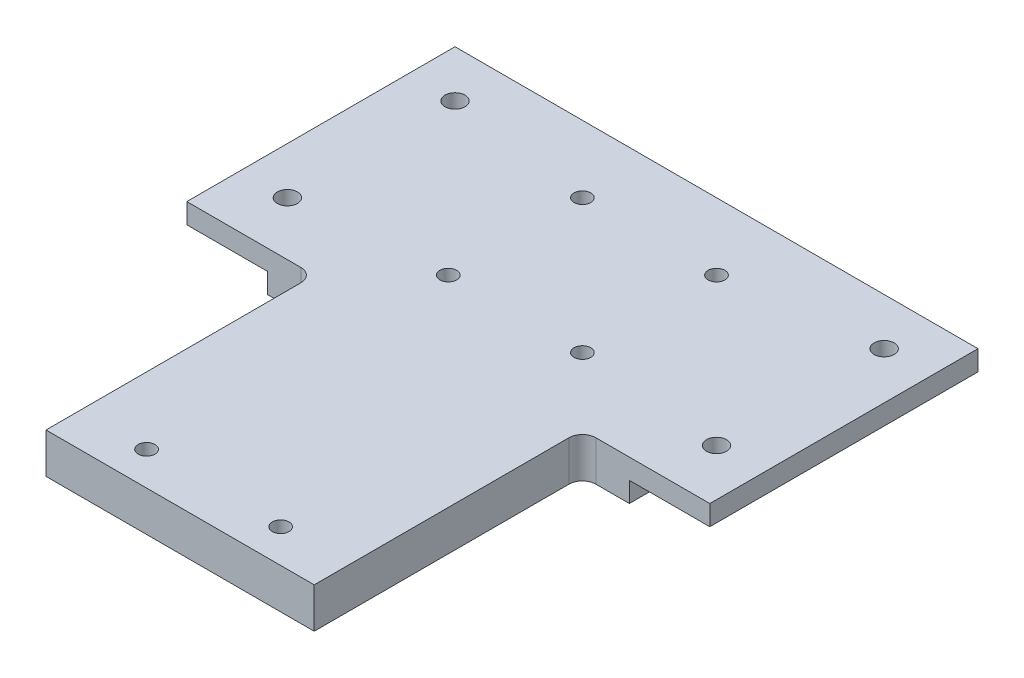
ISO-10303-21;
HEADER;
FILE_DESCRIPTION(('STEP AP214'),'2;1');
FILE_NAME('part.step','',(''),(''),'','','');
FILE_SCHEMA(('AUTOMOTIVE_DESIGN { 1 0 10303 214 1 1 1 1 }'));
ENDSEC;
DATA;
#1=APPLICATION_CONTEXT('core data for automotive mechanical design processes');
#2=APPLICATION_PROTOCOL_DEFINITION('international standard','automotive_design',2000,#1);
#3=PRODUCT_CONTEXT('',#1,'mechanical');
#4=PRODUCT('Part','Part','',(#3));
#5=PRODUCT_RELATED_PRODUCT_CATEGORY('part','',(#4));
#6=PRODUCT_DEFINITION_FORMATION('','',#4);
#7=PRODUCT_DEFINITION_CONTEXT('part definition',#1,'design');
#8=PRODUCT_DEFINITION('design','',#6,#7);
#9=PRODUCT_DEFINITION_SHAPE('','',#8);
#10=(LENGTH_UNIT() NAMED_UNIT(*) SI_UNIT(.MILLI.,.METRE.));
#11=(NAMED_UNIT(*) PLANE_ANGLE_UNIT() SI_UNIT($,.RADIAN.));
#12=(NAMED_UNIT(*) SI_UNIT($,.STERADIAN.) SOLID_ANGLE_UNIT());
#13=UNCERTAINTY_MEASURE_WITH_UNIT(LENGTH_MEASURE(1.E-05),#10,'distance_accuracy_value','');
#14=(GEOMETRIC_REPRESENTATION_CONTEXT(3) GLOBAL_UNCERTAINTY_ASSIGNED_CONTEXT((#13)) GLOBAL_UNIT_ASSIGNED_CONTEXT((#10,
#11,#12)) REPRESENTATION_CONTEXT('',''));
#15=CARTESIAN_POINT('',(0.,0.,0.));
#16=DIRECTION('',(0.,0.,1.));
#17=DIRECTION('',(1.,0.,0.));
#18=AXIS2_PLACEMENT_3D('',#15,#16,#17);
#19=CARTESIAN_POINT('',(59.,6.,-80.));
#20=DIRECTION('',(-1.,0.,0.));
#21=DIRECTION('',(0.,0.,1.));
#22=AXIS2_PLACEMENT_3D('',#19,#20,#21);
#23=PLANE('',#22);
#24=DIRECTION('',(0.,0.,1.));
#25=VECTOR('',#24,1.);
#26=CARTESIAN_POINT('',(59.,3.,-80.));
#27=LINE('',#26,#25);
#28=CARTESIAN_POINT('',(59.,3.,-80.));
#29=VERTEX_POINT('',#28);
#30=CARTESIAN_POINT('',(59.,3.,-40.));
#31=VERTEX_POINT('',#30);
#32=EDGE_CURVE('E260',#29,#31,#27,.T.);
#33=ORIENTED_EDGE('',*,*,#32,.F.);
#34=DIRECTION('',(0.,-1.,0.));
#35=VECTOR('',#34,1.);
#36=CARTESIAN_POINT('',(59.,6.,-80.));
#37=LINE('',#36,#35);
#38=CARTESIAN_POINT('',(59.,6.,-80.));
#39=VERTEX_POINT('',#38);
#40=EDGE_CURVE('E165',#39,#29,#37,.T.);
#41=ORIENTED_EDGE('',*,*,#40,.F.);
#42=DIRECTION('',(0.,0.,-1.));
#43=VECTOR('',#42,1.);
#44=CARTESIAN_POINT('',(59.,6.,-80.));
#45=LINE('',#44,#43);
#46=CARTESIAN_POINT('',(59.,6.,-40.));
#47=VERTEX_POINT('',#46);
#48=EDGE_CURVE('E229',#47,#39,#45,.T.);
#49=ORIENTED_EDGE('',*,*,#48,.F.);
#50=DIRECTION('',(0.,-1.,0.));
#51=VECTOR('',#50,1.);
#52=CARTESIAN_POINT('',(59.,6.,-40.));
#53=LINE('',#52,#51);
#54=EDGE_CURVE('E169',#47,#31,#53,.T.);
#55=ORIENTED_EDGE('',*,*,#54,.T.);
#56=EDGE_LOOP('',(#33,#41,#49,#55));
#57=FACE_BOUND('',#56,.T.);
#58=ADVANCED_FACE('F41',(#57),#23,.F.);
#59=CARTESIAN_POINT('',(0.,6.,-40.));
#60=DIRECTION('',(1.,0.,0.));
#61=DIRECTION('',(0.,0.,-1.));
#62=AXIS2_PLACEMENT_3D('',#59,#60,#61);
#63=PLANE('',#62);
#64=DIRECTION('',(0.,0.,1.));
#65=VECTOR('',#64,1.);
#66=CARTESIAN_POINT('',(0.,6.,-40.));
#67=LINE('',#66,#65);
#68=CARTESIAN_POINT('',(0.,6.,-38.));
#69=VERTEX_POINT('',#68);
#70=CARTESIAN_POINT('',(0.,6.,0.));
#71=VERTEX_POINT('',#70);
#72=EDGE_CURVE('E247',#69,#71,#67,.T.);
#73=ORIENTED_EDGE('',*,*,#72,.F.);
#74=DIRECTION('',(0.,-1.,0.));
#75=VECTOR('',#74,1.);
#76=CARTESIAN_POINT('',(0.,0.,-38.));
#77=LINE('',#76,#75);
#78=CARTESIAN_POINT('',(0.,0.,-38.));
#79=VERTEX_POINT('',#78);
#80=EDGE_CURVE('E183',#69,#79,#77,.T.);
#81=ORIENTED_EDGE('',*,*,#80,.T.);
#82=DIRECTION('',(0.,0.,1.));
#83=VECTOR('',#82,1.);
#84=CARTESIAN_POINT('',(0.,0.,-40.));
#85=LINE('',#84,#83);
#86=CARTESIAN_POINT('',(0.,0.,0.));
#87=VERTEX_POINT('',#86);
#88=EDGE_CURVE('E240',#79,#87,#85,.T.);
#89=ORIENTED_EDGE('',*,*,#88,.T.);
#90=DIRECTION('',(0.,-1.,0.));
#91=VECTOR('',#90,1.);
#92=CARTESIAN_POINT('',(0.,6.,0.));
#93=LINE('',#92,#91);
#94=EDGE_CURVE('E180',#71,#87,#93,.T.);
#95=ORIENTED_EDGE('',*,*,#94,.F.);
#96=EDGE_LOOP('',(#73,#81,#89,#95));
#97=FACE_BOUND('',#96,.T.);
#98=ADVANCED_FACE('F363',(#97),#63,.F.);
#99=CARTESIAN_POINT('',(0.,6.,0.));
#100=DIRECTION('',(0.,0.,-1.));
#101=DIRECTION('',(-1.,0.,0.));
#102=AXIS2_PLACEMENT_3D('',#99,#100,#101);
#103=PLANE('',#102);
#104=DIRECTION('',(1.,0.,0.));
#105=VECTOR('',#104,1.);
#106=CARTESIAN_POINT('',(0.,0.,0.));
#107=LINE('',#106,#105);
#108=CARTESIAN_POINT('',(40.,0.,0.));
#109=VERTEX_POINT('',#108);
#110=EDGE_CURVE('E215',#87,#109,#107,.T.);
#111=ORIENTED_EDGE('',*,*,#110,.T.);
#112=DIRECTION('',(0.,-1.,0.));
#113=VECTOR('',#112,1.);
#114=CARTESIAN_POINT('',(40.,6.,0.));
#115=LINE('',#114,#113);
#116=CARTESIAN_POINT('',(40.,6.,0.));
#117=VERTEX_POINT('',#116);
#118=EDGE_CURVE('E177',#117,#109,#115,.T.);
#119=ORIENTED_EDGE('',*,*,#118,.F.);
#120=DIRECTION('',(1.,0.,0.));
#121=VECTOR('',#120,1.);
#122=CARTESIAN_POINT('',(0.,6.,0.));
#123=LINE('',#122,#121);
#124=EDGE_CURVE('E233',#71,#117,#123,.T.);
#125=ORIENTED_EDGE('',*,*,#124,.F.);
#126=ORIENTED_EDGE('',*,*,#94,.T.);
#127=EDGE_LOOP('',(#111,#119,#125,#126));
#128=FACE_BOUND('',#127,.T.);
#129=ADVANCED_FACE('F371',(#128),#103,.F.);
#130=CARTESIAN_POINT('',(40.,6.,-40.));
#131=DIRECTION('',(-1.,0.,0.));
#132=DIRECTION('',(0.,0.,1.));
#133=AXIS2_PLACEMENT_3D('',#130,#131,#132);
#134=PLANE('',#133);
#135=DIRECTION('',(0.,0.,-1.));
#136=VECTOR('',#135,1.);
#137=CARTESIAN_POINT('',(40.,0.,-40.));
#138=LINE('',#137,#136);
#139=CARTESIAN_POINT('',(40.,0.,-38.));
#140=VERTEX_POINT('',#139);
#141=EDGE_CURVE('E204',#109,#140,#138,.T.);
#142=ORIENTED_EDGE('',*,*,#141,.T.);
#143=DIRECTION('',(0.,-1.,0.));
#144=VECTOR('',#143,1.);
#145=CARTESIAN_POINT('',(40.,6.,-38.));
#146=LINE('',#145,#144);
#147=CARTESIAN_POINT('',(40.,6.,-38.));
#148=VERTEX_POINT('',#147);
#149=EDGE_CURVE('E191',#140,#148,#146,.F.);
#150=ORIENTED_EDGE('',*,*,#149,.T.);
#151=DIRECTION('',(0.,0.,-1.));
#152=VECTOR('',#151,1.);
#153=CARTESIAN_POINT('',(40.,6.,-40.));
#154=LINE('',#153,#152);
#155=EDGE_CURVE('E224',#117,#148,#154,.T.);
#156=ORIENTED_EDGE('',*,*,#155,.F.);
#157=ORIENTED_EDGE('',*,*,#118,.T.);
#158=EDGE_LOOP('',(#142,#150,#156,#157));
#159=FACE_BOUND('',#158,.T.);
#160=ADVANCED_FACE('F211',(#159),#134,.F.);
#161=CARTESIAN_POINT('',(59.,6.,-40.));
#162=DIRECTION('',(0.,0.,-1.));
#163=DIRECTION('',(-1.,0.,0.));
#164=AXIS2_PLACEMENT_3D('',#161,#162,#163);
#165=PLANE('',#164);
#166=DIRECTION('',(1.,0.,0.));
#167=VECTOR('',#166,1.);
#168=CARTESIAN_POINT('',(59.,0.,-40.));
#169=LINE('',#168,#167);
#170=CARTESIAN_POINT('',(42.,0.,-40.));
#171=VERTEX_POINT('',#170);
#172=CARTESIAN_POINT('',(47.,0.,-40.));
#173=VERTEX_POINT('',#172);
#174=EDGE_CURVE('E206',#171,#173,#169,.T.);
#175=ORIENTED_EDGE('',*,*,#174,.T.);
#176=DIRECTION('',(0.,-1.,0.));
#177=VECTOR('',#176,1.);
#178=CARTESIAN_POINT('',(47.,3.,-40.));
#179=LINE('',#178,#177);
#180=CARTESIAN_POINT('',(47.,3.,-40.));
#181=VERTEX_POINT('',#180);
#182=EDGE_CURVE('E56',#181,#173,#179,.T.);
#183=ORIENTED_EDGE('',*,*,#182,.F.);
#184=DIRECTION('',(-1.,0.,0.));
#185=VECTOR('',#184,1.);
#186=CARTESIAN_POINT('',(59.,3.,-40.));
#187=LINE('',#186,#185);
#188=EDGE_CURVE('E262',#31,#181,#187,.T.);
#189=ORIENTED_EDGE('',*,*,#188,.F.);
#190=ORIENTED_EDGE('',*,*,#54,.F.);
#191=DIRECTION('',(1.,0.,0.));
#192=VECTOR('',#191,1.);
#193=CARTESIAN_POINT('',(59.,6.,-40.));
#194=LINE('',#193,#192);
#195=CARTESIAN_POINT('',(42.,6.,-40.));
#196=VERTEX_POINT('',#195);
#197=EDGE_CURVE('E222',#196,#47,#194,.T.);
#198=ORIENTED_EDGE('',*,*,#197,.F.);
#199=DIRECTION('',(0.,-1.,0.));
#200=VECTOR('',#199,1.);
#201=CARTESIAN_POINT('',(42.,0.,-40.));
#202=LINE('',#201,#200);
#203=EDGE_CURVE('E188',#196,#171,#202,.T.);
#204=ORIENTED_EDGE('',*,*,#203,.T.);
#205=EDGE_LOOP('',(#175,#183,#189,#190,#198,#204));
#206=FACE_BOUND('',#205,.T.);
#207=ADVANCED_FACE('F226',(#206),#165,.F.);
#208=CARTESIAN_POINT('',(-19.,6.,-80.));
#209=DIRECTION('',(0.,0.,1.));
#210=DIRECTION('',(1.,0.,0.));
#211=AXIS2_PLACEMENT_3D('',#208,#209,#210);
#212=PLANE('',#211);
#213=DIRECTION('',(-1.,0.,0.));
#214=VECTOR('',#213,1.);
#215=CARTESIAN_POINT('',(-19.,0.,-80.));
#216=LINE('',#215,#214);
#217=CARTESIAN_POINT('',(47.,0.,-80.));
#218=VERTEX_POINT('',#217);
#219=CARTESIAN_POINT('',(-6.99999999999998,0.,-80.));
#220=VERTEX_POINT('',#219);
#221=EDGE_CURVE('E245',#218,#220,#216,.T.);
#222=ORIENTED_EDGE('',*,*,#221,.T.);
#223=DIRECTION('',(0.,-1.,0.));
#224=VECTOR('',#223,1.);
#225=CARTESIAN_POINT('',(-6.99999999999998,3.,-80.));
#226=LINE('',#225,#224);
#227=CARTESIAN_POINT('',(-6.99999999999998,3.,-80.));
#228=VERTEX_POINT('',#227);
#229=EDGE_CURVE('E64',#228,#220,#226,.T.);
#230=ORIENTED_EDGE('',*,*,#229,.F.);
#231=DIRECTION('',(1.,0.,0.));
#232=VECTOR('',#231,1.);
#233=CARTESIAN_POINT('',(-6.99999999999998,3.,-80.));
#234=LINE('',#233,#232);
#235=CARTESIAN_POINT('',(-19.,3.,-80.));
#236=VERTEX_POINT('',#235);
#237=EDGE_CURVE('E145',#236,#228,#234,.T.);
#238=ORIENTED_EDGE('',*,*,#237,.F.);
#239=DIRECTION('',(0.,-1.,0.));
#240=VECTOR('',#239,1.);
#241=CARTESIAN_POINT('',(-19.,6.,-80.));
#242=LINE('',#241,#240);
#243=CARTESIAN_POINT('',(-19.,6.,-80.));
#244=VERTEX_POINT('',#243);
#245=EDGE_CURVE('E159',#244,#236,#242,.T.);
#246=ORIENTED_EDGE('',*,*,#245,.F.);
#247=DIRECTION('',(-1.,0.,0.));
#248=VECTOR('',#247,1.);
#249=CARTESIAN_POINT('',(-19.,6.,-80.));
#250=LINE('',#249,#248);
#251=EDGE_CURVE('E231',#39,#244,#250,.T.);
#252=ORIENTED_EDGE('',*,*,#251,.F.);
#253=ORIENTED_EDGE('',*,*,#40,.T.);
#254=DIRECTION('',(1.,0.,0.));
#255=VECTOR('',#254,1.);
#256=CARTESIAN_POINT('',(47.,3.,-80.));
#257=LINE('',#256,#255);
#258=CARTESIAN_POINT('',(47.,3.,-80.));
#259=VERTEX_POINT('',#258);
#260=EDGE_CURVE('E258',#259,#29,#257,.T.);
#261=ORIENTED_EDGE('',*,*,#260,.F.);
#262=DIRECTION('',(0.,-1.,0.));
#263=VECTOR('',#262,1.);
#264=CARTESIAN_POINT('',(47.,3.,-80.));
#265=LINE('',#264,#263);
#266=EDGE_CURVE('E265',#259,#218,#265,.T.);
#267=ORIENTED_EDGE('',*,*,#266,.T.);
#268=EDGE_LOOP('',(#222,#230,#238,#246,#252,#253,#261,#267));
#269=FACE_BOUND('',#268,.T.);
#270=ADVANCED_FACE('F157',(#269),#212,.F.);
#271=CARTESIAN_POINT('',(-19.,6.,-80.));
#272=DIRECTION('',(1.,0.,0.));
#273=DIRECTION('',(0.,0.,-1.));
#274=AXIS2_PLACEMENT_3D('',#271,#272,#273);
#275=PLANE('',#274);
#276=ORIENTED_EDGE('',*,*,#245,.T.);
#277=DIRECTION('',(0.,0.,-1.));
#278=VECTOR('',#277,1.);
#279=CARTESIAN_POINT('',(-19.,3.,-80.));
#280=LINE('',#279,#278);
#281=CARTESIAN_POINT('',(-19.,3.,-40.));
#282=VERTEX_POINT('',#281);
#283=EDGE_CURVE('E141',#282,#236,#280,.T.);
#284=ORIENTED_EDGE('',*,*,#283,.F.);
#285=DIRECTION('',(0.,-1.,0.));
#286=VECTOR('',#285,1.);
#287=CARTESIAN_POINT('',(-19.,6.,-40.));
#288=LINE('',#287,#286);
#289=CARTESIAN_POINT('',(-19.,6.,-40.));
#290=VERTEX_POINT('',#289);
#291=EDGE_CURVE('E166',#290,#282,#288,.T.);
#292=ORIENTED_EDGE('',*,*,#291,.F.);
#293=DIRECTION('',(0.,0.,1.));
#294=VECTOR('',#293,1.);
#295=CARTESIAN_POINT('',(-19.,6.,-80.));
#296=LINE('',#295,#294);
#297=EDGE_CURVE('E164',#244,#290,#296,.T.);
#298=ORIENTED_EDGE('',*,*,#297,.F.);
#299=EDGE_LOOP('',(#276,#284,#292,#298));
#300=FACE_BOUND('',#299,.T.);
#301=ADVANCED_FACE('F163',(#300),#275,.F.);
#302=CARTESIAN_POINT('',(-19.,6.,-40.));
#303=DIRECTION('',(0.,0.,-1.));
#304=DIRECTION('',(-1.,0.,0.));
#305=AXIS2_PLACEMENT_3D('',#302,#303,#304);
#306=PLANE('',#305);
#307=DIRECTION('',(-1.,0.,0.));
#308=VECTOR('',#307,1.);
#309=CARTESIAN_POINT('',(-19.,3.,-40.));
#310=LINE('',#309,#308);
#311=CARTESIAN_POINT('',(-6.99999999999999,3.,-40.));
#312=VERTEX_POINT('',#311);
#313=EDGE_CURVE('E147',#312,#282,#310,.T.);
#314=ORIENTED_EDGE('',*,*,#313,.F.);
#315=DIRECTION('',(0.,-1.,0.));
#316=VECTOR('',#315,1.);
#317=CARTESIAN_POINT('',(-6.99999999999999,3.,-40.));
#318=LINE('',#317,#316);
#319=CARTESIAN_POINT('',(-6.99999999999999,0.,-40.));
#320=VERTEX_POINT('',#319);
#321=EDGE_CURVE('E242',#312,#320,#318,.T.);
#322=ORIENTED_EDGE('',*,*,#321,.T.);
#323=DIRECTION('',(1.,0.,0.));
#324=VECTOR('',#323,1.);
#325=CARTESIAN_POINT('',(-19.,0.,-40.));
#326=LINE('',#325,#324);
#327=CARTESIAN_POINT('',(-2.,0.,-40.));
#328=VERTEX_POINT('',#327);
#329=EDGE_CURVE('E246',#320,#328,#326,.T.);
#330=ORIENTED_EDGE('',*,*,#329,.T.);
#331=DIRECTION('',(0.,-1.,0.));
#332=VECTOR('',#331,1.);
#333=CARTESIAN_POINT('',(-2.,6.,-40.));
#334=LINE('',#333,#332);
#335=CARTESIAN_POINT('',(-2.,6.,-40.));
#336=VERTEX_POINT('',#335);
#337=EDGE_CURVE('E186',#328,#336,#334,.F.);
#338=ORIENTED_EDGE('',*,*,#337,.T.);
#339=DIRECTION('',(1.,0.,0.));
#340=VECTOR('',#339,1.);
#341=CARTESIAN_POINT('',(-19.,6.,-40.));
#342=LINE('',#341,#340);
#343=EDGE_CURVE('E171',#290,#336,#342,.T.);
#344=ORIENTED_EDGE('',*,*,#343,.F.);
#345=ORIENTED_EDGE('',*,*,#291,.T.);
#346=EDGE_LOOP('',(#314,#322,#330,#338,#344,#345));
#347=FACE_BOUND('',#346,.T.);
#348=ADVANCED_FACE('F399',(#347),#306,.F.);
#349=CARTESIAN_POINT('',(0.,6.,0.));
#350=DIRECTION('',(0.,1.,0.));
#351=DIRECTION('',(0.,0.,1.));
#352=AXIS2_PLACEMENT_3D('',#349,#350,#351);
#353=PLANE('',#352);
#354=CARTESIAN_POINT('',(30.,6.,-50.));
#355=DIRECTION('',(0.,1.,0.));
#356=DIRECTION('',(0.,0.,1.));
#357=AXIS2_PLACEMENT_3D('',#354,#355,#356);
#358=CIRCLE('',#357,1.25);
#359=CARTESIAN_POINT('',(30.,6.,-48.75));
#360=VERTEX_POINT('',#359);
#361=EDGE_CURVE('E295',#360,#360,#358,.T.);
#362=ORIENTED_EDGE('',*,*,#361,.F.);
#363=EDGE_LOOP('',(#362));
#364=FACE_BOUND('',#363,.T.);
#365=CARTESIAN_POINT('',(10.,6.,-50.));
#366=DIRECTION('',(0.,1.,0.));
#367=DIRECTION('',(0.,0.,1.));
#368=AXIS2_PLACEMENT_3D('',#365,#366,#367);
#369=CIRCLE('',#368,1.25);
#370=CARTESIAN_POINT('',(10.,6.,-48.75));
#371=VERTEX_POINT('',#370);
#372=EDGE_CURVE('E302',#371,#371,#369,.T.);
#373=ORIENTED_EDGE('',*,*,#372,.F.);
#374=EDGE_LOOP('',(#373));
#375=FACE_BOUND('',#374,.T.);
#376=CARTESIAN_POINT('',(10.,6.,-70.));
#377=DIRECTION('',(0.,1.,0.));
#378=DIRECTION('',(0.,0.,1.));
#379=AXIS2_PLACEMENT_3D('',#376,#377,#378);
#380=CIRCLE('',#379,1.25);
#381=CARTESIAN_POINT('',(10.,6.,-68.75));
#382=VERTEX_POINT('',#381);
#383=EDGE_CURVE('E305',#382,#382,#380,.T.);
#384=ORIENTED_EDGE('',*,*,#383,.F.);
#385=EDGE_LOOP('',(#384));
#386=FACE_BOUND('',#385,.T.);
#387=CARTESIAN_POINT('',(30.,6.,-5.));
#388=DIRECTION('',(0.,1.,0.));
#389=DIRECTION('',(0.,0.,1.));
#390=AXIS2_PLACEMENT_3D('',#387,#388,#389);
#391=CIRCLE('',#390,1.25);
#392=CARTESIAN_POINT('',(30.,6.,-3.75));
#393=VERTEX_POINT('',#392);
#394=EDGE_CURVE('E308',#393,#393,#391,.T.);
#395=ORIENTED_EDGE('',*,*,#394,.F.);
#396=EDGE_LOOP('',(#395));
#397=FACE_BOUND('',#396,.T.);
#398=CARTESIAN_POINT('',(30.,6.,-70.));
#399=DIRECTION('',(0.,1.,0.));
#400=DIRECTION('',(0.,0.,1.));
#401=AXIS2_PLACEMENT_3D('',#398,#399,#400);
#402=CIRCLE('',#401,1.25);
#403=CARTESIAN_POINT('',(30.,6.,-68.75));
#404=VERTEX_POINT('',#403);
#405=EDGE_CURVE('E311',#404,#404,#402,.T.);
#406=ORIENTED_EDGE('',*,*,#405,.F.);
#407=EDGE_LOOP('',(#406));
#408=FACE_BOUND('',#407,.T.);
#409=CARTESIAN_POINT('',(10.,6.,-5.));
#410=DIRECTION('',(0.,1.,0.));
#411=DIRECTION('',(0.,0.,1.));
#412=AXIS2_PLACEMENT_3D('',#409,#410,#411);
#413=CIRCLE('',#412,1.25);
#414=CARTESIAN_POINT('',(10.,6.,-3.75));
#415=VERTEX_POINT('',#414);
#416=EDGE_CURVE('E314',#415,#415,#413,.T.);
#417=ORIENTED_EDGE('',*,*,#416,.F.);
#418=EDGE_LOOP('',(#417));
#419=FACE_BOUND('',#418,.T.);
#420=CARTESIAN_POINT('',(52.,6.,-48.));
#421=DIRECTION('',(0.,1.,0.));
#422=DIRECTION('',(0.,0.,1.));
#423=AXIS2_PLACEMENT_3D('',#420,#421,#422);
#424=CIRCLE('',#423,1.50000000000001);
#425=CARTESIAN_POINT('',(52.,6.,-46.5));
#426=VERTEX_POINT('',#425);
#427=EDGE_CURVE('E268',#426,#426,#424,.T.);
#428=ORIENTED_EDGE('',*,*,#427,.F.);
#429=EDGE_LOOP('',(#428));
#430=FACE_BOUND('',#429,.T.);
#431=CARTESIAN_POINT('',(52.,6.,-73.));
#432=DIRECTION('',(0.,1.,0.));
#433=DIRECTION('',(0.,0.,1.));
#434=AXIS2_PLACEMENT_3D('',#431,#432,#433);
#435=CIRCLE('',#434,1.5);
#436=CARTESIAN_POINT('',(52.,6.,-71.5));
#437=VERTEX_POINT('',#436);
#438=EDGE_CURVE('E278',#437,#437,#435,.T.);
#439=ORIENTED_EDGE('',*,*,#438,.F.);
#440=EDGE_LOOP('',(#439));
#441=FACE_BOUND('',#440,.T.);
#442=CARTESIAN_POINT('',(-12.,6.,-73.));
#443=DIRECTION('',(0.,1.,0.));
#444=DIRECTION('',(0.,0.,1.));
#445=AXIS2_PLACEMENT_3D('',#442,#443,#444);
#446=CIRCLE('',#445,1.5);
#447=CARTESIAN_POINT('',(-12.,6.,-71.5));
#448=VERTEX_POINT('',#447);
#449=EDGE_CURVE('E281',#448,#448,#446,.T.);
#450=ORIENTED_EDGE('',*,*,#449,.F.);
#451=EDGE_LOOP('',(#450));
#452=FACE_BOUND('',#451,.T.);
#453=CARTESIAN_POINT('',(-12.,6.,-48.));
#454=DIRECTION('',(0.,1.,0.));
#455=DIRECTION('',(0.,0.,1.));
#456=AXIS2_PLACEMENT_3D('',#453,#454,#455);
#457=CIRCLE('',#456,1.5);
#458=CARTESIAN_POINT('',(-12.,6.,-46.5));
#459=VERTEX_POINT('',#458);
#460=EDGE_CURVE('E284',#459,#459,#457,.T.);
#461=ORIENTED_EDGE('',*,*,#460,.F.);
#462=EDGE_LOOP('',(#461));
#463=FACE_BOUND('',#462,.T.);
#464=ORIENTED_EDGE('',*,*,#343,.T.);
#465=CARTESIAN_POINT('',(-2.,6.,-38.));
#466=DIRECTION('',(0.,1.,0.));
#467=DIRECTION('',(0.,0.,1.));
#468=AXIS2_PLACEMENT_3D('',#465,#466,#467);
#469=CIRCLE('',#468,2.);
#470=EDGE_CURVE('E196',#336,#69,#469,.F.);
#471=ORIENTED_EDGE('',*,*,#470,.T.);
#472=ORIENTED_EDGE('',*,*,#72,.T.);
#473=ORIENTED_EDGE('',*,*,#124,.T.);
#474=ORIENTED_EDGE('',*,*,#155,.T.);
#475=CARTESIAN_POINT('',(42.,6.,-38.));
#476=DIRECTION('',(0.,1.,0.));
#477=DIRECTION('',(0.,0.,1.));
#478=AXIS2_PLACEMENT_3D('',#475,#476,#477);
#479=CIRCLE('',#478,2.);
#480=EDGE_CURVE('E11',#148,#196,#479,.F.);
#481=ORIENTED_EDGE('',*,*,#480,.T.);
#482=ORIENTED_EDGE('',*,*,#197,.T.);
#483=ORIENTED_EDGE('',*,*,#48,.T.);
#484=ORIENTED_EDGE('',*,*,#251,.T.);
#485=ORIENTED_EDGE('',*,*,#297,.T.);
#486=EDGE_LOOP('',(#464,#471,#472,#473,#474,#481,#482,#483,#484,#485));
#487=FACE_BOUND('',#486,.T.);
#488=ADVANCED_FACE('F221',(#364,#375,#386,#397,#408,#419,#430,#441,#452,#463,#487),#353,.T.);
#489=CARTESIAN_POINT('',(0.,0.,0.));
#490=DIRECTION('',(0.,1.,0.));
#491=DIRECTION('',(0.,0.,1.));
#492=AXIS2_PLACEMENT_3D('',#489,#490,#491);
#493=PLANE('',#492);
#494=CARTESIAN_POINT('',(30.,0.,-50.));
#495=DIRECTION('',(0.,-1.,0.));
#496=DIRECTION('',(0.,0.,-1.));
#497=AXIS2_PLACEMENT_3D('',#494,#495,#496);
#498=CIRCLE('',#497,1.25);
#499=CARTESIAN_POINT('',(30.,0.,-51.25));
#500=VERTEX_POINT('',#499);
#501=EDGE_CURVE('E327',#500,#500,#498,.T.);
#502=ORIENTED_EDGE('',*,*,#501,.F.);
#503=EDGE_LOOP('',(#502));
#504=FACE_BOUND('',#503,.T.);
#505=CARTESIAN_POINT('',(10.,0.,-50.));
#506=DIRECTION('',(0.,-1.,0.));
#507=DIRECTION('',(0.,0.,-1.));
#508=AXIS2_PLACEMENT_3D('',#505,#506,#507);
#509=CIRCLE('',#508,1.25);
#510=CARTESIAN_POINT('',(10.,0.,-51.25));
#511=VERTEX_POINT('',#510);
#512=EDGE_CURVE('E324',#511,#511,#509,.T.);
#513=ORIENTED_EDGE('',*,*,#512,.F.);
#514=EDGE_LOOP('',(#513));
#515=FACE_BOUND('',#514,.T.);
#516=CARTESIAN_POINT('',(10.,0.,-70.));
#517=DIRECTION('',(0.,-1.,0.));
#518=DIRECTION('',(0.,0.,-1.));
#519=AXIS2_PLACEMENT_3D('',#516,#517,#518);
#520=CIRCLE('',#519,1.25);
#521=CARTESIAN_POINT('',(10.,0.,-71.25));
#522=VERTEX_POINT('',#521);
#523=EDGE_CURVE('E321',#522,#522,#520,.T.);
#524=ORIENTED_EDGE('',*,*,#523,.F.);
#525=EDGE_LOOP('',(#524));
#526=FACE_BOUND('',#525,.T.);
#527=CARTESIAN_POINT('',(30.,0.,-5.));
#528=DIRECTION('',(0.,-1.,0.));
#529=DIRECTION('',(0.,0.,-1.));
#530=AXIS2_PLACEMENT_3D('',#527,#528,#529);
#531=CIRCLE('',#530,1.25);
#532=CARTESIAN_POINT('',(30.,0.,-6.25));
#533=VERTEX_POINT('',#532);
#534=EDGE_CURVE('E320',#533,#533,#531,.T.);
#535=ORIENTED_EDGE('',*,*,#534,.F.);
#536=EDGE_LOOP('',(#535));
#537=FACE_BOUND('',#536,.T.);
#538=CARTESIAN_POINT('',(30.,0.,-70.));
#539=DIRECTION('',(0.,-1.,0.));
#540=DIRECTION('',(0.,0.,-1.));
#541=AXIS2_PLACEMENT_3D('',#538,#539,#540);
#542=CIRCLE('',#541,1.25);
#543=CARTESIAN_POINT('',(30.,0.,-71.25));
#544=VERTEX_POINT('',#543);
#545=EDGE_CURVE('E330',#544,#544,#542,.T.);
#546=ORIENTED_EDGE('',*,*,#545,.F.);
#547=EDGE_LOOP('',(#546));
#548=FACE_BOUND('',#547,.T.);
#549=CARTESIAN_POINT('',(10.,0.,-5.));
#550=DIRECTION('',(0.,-1.,0.));
#551=DIRECTION('',(0.,0.,-1.));
#552=AXIS2_PLACEMENT_3D('',#549,#550,#551);
#553=CIRCLE('',#552,1.25);
#554=CARTESIAN_POINT('',(10.,0.,-6.25));
#555=VERTEX_POINT('',#554);
#556=EDGE_CURVE('E317',#555,#555,#553,.T.);
#557=ORIENTED_EDGE('',*,*,#556,.F.);
#558=EDGE_LOOP('',(#557));
#559=FACE_BOUND('',#558,.T.);
#560=ORIENTED_EDGE('',*,*,#329,.F.);
#561=DIRECTION('',(0.,0.,1.));
#562=VECTOR('',#561,1.);
#563=CARTESIAN_POINT('',(-6.99999999999999,0.,-40.));
#564=LINE('',#563,#562);
#565=EDGE_CURVE('E152',#220,#320,#564,.T.);
#566=ORIENTED_EDGE('',*,*,#565,.F.);
#567=ORIENTED_EDGE('',*,*,#221,.F.);
#568=DIRECTION('',(0.,0.,-1.));
#569=VECTOR('',#568,1.);
#570=CARTESIAN_POINT('',(47.,0.,-40.));
#571=LINE('',#570,#569);
#572=EDGE_CURVE('E257',#173,#218,#571,.T.);
#573=ORIENTED_EDGE('',*,*,#572,.F.);
#574=ORIENTED_EDGE('',*,*,#174,.F.);
#575=CARTESIAN_POINT('',(42.,0.,-38.));
#576=DIRECTION('',(0.,1.,0.));
#577=DIRECTION('',(0.,0.,1.));
#578=AXIS2_PLACEMENT_3D('',#575,#576,#577);
#579=CIRCLE('',#578,2.);
#580=EDGE_CURVE('E49',#171,#140,#579,.T.);
#581=ORIENTED_EDGE('',*,*,#580,.T.);
#582=ORIENTED_EDGE('',*,*,#141,.F.);
#583=ORIENTED_EDGE('',*,*,#110,.F.);
#584=ORIENTED_EDGE('',*,*,#88,.F.);
#585=CARTESIAN_POINT('',(-2.,0.,-38.));
#586=DIRECTION('',(0.,1.,0.));
#587=DIRECTION('',(0.,0.,1.));
#588=AXIS2_PLACEMENT_3D('',#585,#586,#587);
#589=CIRCLE('',#588,2.);
#590=EDGE_CURVE('E193',#79,#328,#589,.T.);
#591=ORIENTED_EDGE('',*,*,#590,.T.);
#592=EDGE_LOOP('',(#560,#566,#567,#573,#574,#581,#582,#583,#584,#591));
#593=FACE_BOUND('',#592,.T.);
#594=ADVANCED_FACE('F202',(#504,#515,#526,#537,#548,#559,#593),#493,.F.);
#595=CARTESIAN_POINT('',(-2.,6.,-38.));
#596=DIRECTION('',(0.,1.,0.));
#597=DIRECTION('',(0.,0.,1.));
#598=AXIS2_PLACEMENT_3D('',#595,#596,#597);
#599=CYLINDRICAL_SURFACE('',#598,2.);
#600=ORIENTED_EDGE('',*,*,#470,.F.);
#601=ORIENTED_EDGE('',*,*,#337,.F.);
#602=ORIENTED_EDGE('',*,*,#590,.F.);
#603=ORIENTED_EDGE('',*,*,#80,.F.);
#604=EDGE_LOOP('',(#600,#601,#602,#603));
#605=FACE_BOUND('',#604,.T.);
#606=ADVANCED_FACE('F340',(#605),#599,.F.);
#607=CARTESIAN_POINT('',(42.,6.,-38.));
#608=DIRECTION('',(0.,1.,0.));
#609=DIRECTION('',(0.,0.,1.));
#610=AXIS2_PLACEMENT_3D('',#607,#608,#609);
#611=CYLINDRICAL_SURFACE('',#610,2.);
#612=ORIENTED_EDGE('',*,*,#480,.F.);
#613=ORIENTED_EDGE('',*,*,#149,.F.);
#614=ORIENTED_EDGE('',*,*,#580,.F.);
#615=ORIENTED_EDGE('',*,*,#203,.F.);
#616=EDGE_LOOP('',(#612,#613,#614,#615));
#617=FACE_BOUND('',#616,.T.);
#618=ADVANCED_FACE('F43',(#617),#611,.F.);
#619=CARTESIAN_POINT('',(47.,3.,-40.));
#620=DIRECTION('',(-1.,0.,0.));
#621=DIRECTION('',(0.,0.,1.));
#622=AXIS2_PLACEMENT_3D('',#619,#620,#621);
#623=PLANE('',#622);
#624=ORIENTED_EDGE('',*,*,#572,.T.);
#625=ORIENTED_EDGE('',*,*,#266,.F.);
#626=DIRECTION('',(0.,0.,-1.));
#627=VECTOR('',#626,1.);
#628=CARTESIAN_POINT('',(47.,3.,-40.));
#629=LINE('',#628,#627);
#630=EDGE_CURVE('E254',#181,#259,#629,.T.);
#631=ORIENTED_EDGE('',*,*,#630,.F.);
#632=ORIENTED_EDGE('',*,*,#182,.T.);
#633=EDGE_LOOP('',(#624,#625,#631,#632));
#634=FACE_BOUND('',#633,.T.);
#635=ADVANCED_FACE('F387',(#634),#623,.F.);
#636=CARTESIAN_POINT('',(0.,3.,0.));
#637=DIRECTION('',(0.,-1.,0.));
#638=DIRECTION('',(0.,0.,-1.));
#639=AXIS2_PLACEMENT_3D('',#636,#637,#638);
#640=PLANE('',#639);
#641=CARTESIAN_POINT('',(52.,3.,-48.));
#642=DIRECTION('',(0.,-1.,0.));
#643=DIRECTION('',(0.,0.,1.));
#644=AXIS2_PLACEMENT_3D('',#641,#642,#643);
#645=CIRCLE('',#644,1.50000000000001);
#646=CARTESIAN_POINT('',(52.,3.,-46.5));
#647=VERTEX_POINT('',#646);
#648=EDGE_CURVE('E291',#647,#647,#645,.T.);
#649=ORIENTED_EDGE('',*,*,#648,.F.);
#650=EDGE_LOOP('',(#649));
#651=FACE_BOUND('',#650,.T.);
#652=CARTESIAN_POINT('',(52.,3.,-73.));
#653=DIRECTION('',(0.,-1.,0.));
#654=DIRECTION('',(0.,0.,1.));
#655=AXIS2_PLACEMENT_3D('',#652,#653,#654);
#656=CIRCLE('',#655,1.5);
#657=CARTESIAN_POINT('',(52.,3.,-71.5));
#658=VERTEX_POINT('',#657);
#659=EDGE_CURVE('E294',#658,#658,#656,.T.);
#660=ORIENTED_EDGE('',*,*,#659,.F.);
#661=EDGE_LOOP('',(#660));
#662=FACE_BOUND('',#661,.T.);
#663=ORIENTED_EDGE('',*,*,#630,.T.);
#664=ORIENTED_EDGE('',*,*,#260,.T.);
#665=ORIENTED_EDGE('',*,*,#32,.T.);
#666=ORIENTED_EDGE('',*,*,#188,.T.);
#667=EDGE_LOOP('',(#663,#664,#665,#666));
#668=FACE_BOUND('',#667,.T.);
#669=ADVANCED_FACE('F397',(#651,#662,#668),#640,.T.);
#670=CARTESIAN_POINT('',(-6.99999999999999,3.,-40.));
#671=DIRECTION('',(1.,0.,0.));
#672=DIRECTION('',(0.,0.,-1.));
#673=AXIS2_PLACEMENT_3D('',#670,#671,#672);
#674=PLANE('',#673);
#675=ORIENTED_EDGE('',*,*,#565,.T.);
#676=ORIENTED_EDGE('',*,*,#321,.F.);
#677=DIRECTION('',(0.,0.,1.));
#678=VECTOR('',#677,1.);
#679=CARTESIAN_POINT('',(-6.99999999999999,3.,-40.));
#680=LINE('',#679,#678);
#681=EDGE_CURVE('E161',#228,#312,#680,.T.);
#682=ORIENTED_EDGE('',*,*,#681,.F.);
#683=ORIENTED_EDGE('',*,*,#229,.T.);
#684=EDGE_LOOP('',(#675,#676,#682,#683));
#685=FACE_BOUND('',#684,.T.);
#686=ADVANCED_FACE('F412',(#685),#674,.F.);
#687=CARTESIAN_POINT('',(0.,3.,0.));
#688=DIRECTION('',(0.,1.,0.));
#689=DIRECTION('',(0.,0.,1.));
#690=AXIS2_PLACEMENT_3D('',#687,#688,#689);
#691=PLANE('',#690);
#692=CARTESIAN_POINT('',(-12.,3.,-73.));
#693=DIRECTION('',(0.,-1.,0.));
#694=DIRECTION('',(0.,0.,-1.));
#695=AXIS2_PLACEMENT_3D('',#692,#693,#694);
#696=CIRCLE('',#695,1.5);
#697=CARTESIAN_POINT('',(-12.,3.,-74.5));
#698=VERTEX_POINT('',#697);
#699=EDGE_CURVE('E290',#698,#698,#696,.T.);
#700=ORIENTED_EDGE('',*,*,#699,.F.);
#701=EDGE_LOOP('',(#700));
#702=FACE_BOUND('',#701,.T.);
#703=CARTESIAN_POINT('',(-12.,3.,-48.));
#704=DIRECTION('',(0.,-1.,0.));
#705=DIRECTION('',(0.,0.,-1.));
#706=AXIS2_PLACEMENT_3D('',#703,#704,#705);
#707=CIRCLE('',#706,1.5);
#708=CARTESIAN_POINT('',(-12.,3.,-49.5));
#709=VERTEX_POINT('',#708);
#710=EDGE_CURVE('E287',#709,#709,#707,.T.);
#711=ORIENTED_EDGE('',*,*,#710,.F.);
#712=EDGE_LOOP('',(#711));
#713=FACE_BOUND('',#712,.T.);
#714=ORIENTED_EDGE('',*,*,#283,.T.);
#715=ORIENTED_EDGE('',*,*,#237,.T.);
#716=ORIENTED_EDGE('',*,*,#681,.T.);
#717=ORIENTED_EDGE('',*,*,#313,.T.);
#718=EDGE_LOOP('',(#714,#715,#716,#717));
#719=FACE_BOUND('',#718,.T.);
#720=ADVANCED_FACE('F143',(#702,#713,#719),#691,.F.);
#721=CARTESIAN_POINT('',(-12.,13.,-48.));
#722=DIRECTION('',(0.,-1.,0.));
#723=DIRECTION('',(0.,0.,-1.));
#724=AXIS2_PLACEMENT_3D('',#721,#722,#723);
#725=CYLINDRICAL_SURFACE('',#724,1.5);
#726=ORIENTED_EDGE('',*,*,#460,.T.);
#727=EDGE_LOOP('',(#726));
#728=FACE_BOUND('',#727,.T.);
#729=ORIENTED_EDGE('',*,*,#710,.T.);
#730=EDGE_LOOP('',(#729));
#731=FACE_BOUND('',#730,.T.);
#732=ADVANCED_FACE('F419',(#728,#731),#725,.F.);
#733=CARTESIAN_POINT('',(-12.,13.,-73.));
#734=DIRECTION('',(0.,-1.,0.));
#735=DIRECTION('',(0.,0.,-1.));
#736=AXIS2_PLACEMENT_3D('',#733,#734,#735);
#737=CYLINDRICAL_SURFACE('',#736,1.5);
#738=ORIENTED_EDGE('',*,*,#449,.T.);
#739=EDGE_LOOP('',(#738));
#740=FACE_BOUND('',#739,.T.);
#741=ORIENTED_EDGE('',*,*,#699,.T.);
#742=EDGE_LOOP('',(#741));
#743=FACE_BOUND('',#742,.T.);
#744=ADVANCED_FACE('F422',(#740,#743),#737,.F.);
#745=CARTESIAN_POINT('',(52.,13.,-73.));
#746=DIRECTION('',(0.,-1.,0.));
#747=DIRECTION('',(0.,0.,-1.));
#748=AXIS2_PLACEMENT_3D('',#745,#746,#747);
#749=CYLINDRICAL_SURFACE('',#748,1.5);
#750=ORIENTED_EDGE('',*,*,#438,.T.);
#751=EDGE_LOOP('',(#750));
#752=FACE_BOUND('',#751,.T.);
#753=ORIENTED_EDGE('',*,*,#659,.T.);
#754=EDGE_LOOP('',(#753));
#755=FACE_BOUND('',#754,.T.);
#756=ADVANCED_FACE('F357',(#752,#755),#749,.F.);
#757=CARTESIAN_POINT('',(52.,13.,-48.));
#758=DIRECTION('',(0.,-1.,0.));
#759=DIRECTION('',(0.,0.,-1.));
#760=AXIS2_PLACEMENT_3D('',#757,#758,#759);
#761=CYLINDRICAL_SURFACE('',#760,1.50000000000001);
#762=ORIENTED_EDGE('',*,*,#427,.T.);
#763=EDGE_LOOP('',(#762));
#764=FACE_BOUND('',#763,.T.);
#765=ORIENTED_EDGE('',*,*,#648,.T.);
#766=EDGE_LOOP('',(#765));
#767=FACE_BOUND('',#766,.T.);
#768=ADVANCED_FACE('F347',(#764,#767),#761,.F.);
#769=CARTESIAN_POINT('',(10.,10.,-5.));
#770=DIRECTION('',(0.,-1.,0.));
#771=DIRECTION('',(0.,0.,-1.));
#772=AXIS2_PLACEMENT_3D('',#769,#770,#771);
#773=CYLINDRICAL_SURFACE('',#772,1.25);
#774=ORIENTED_EDGE('',*,*,#416,.T.);
#775=EDGE_LOOP('',(#774));
#776=FACE_BOUND('',#775,.T.);
#777=ORIENTED_EDGE('',*,*,#556,.T.);
#778=EDGE_LOOP('',(#777));
#779=FACE_BOUND('',#778,.T.);
#780=ADVANCED_FACE('F345',(#776,#779),#773,.F.);
#781=CARTESIAN_POINT('',(30.,10.,-70.));
#782=DIRECTION('',(0.,-1.,0.));
#783=DIRECTION('',(0.,0.,-1.));
#784=AXIS2_PLACEMENT_3D('',#781,#782,#783);
#785=CYLINDRICAL_SURFACE('',#784,1.25);
#786=ORIENTED_EDGE('',*,*,#405,.T.);
#787=EDGE_LOOP('',(#786));
#788=FACE_BOUND('',#787,.T.);
#789=ORIENTED_EDGE('',*,*,#545,.T.);
#790=EDGE_LOOP('',(#789));
#791=FACE_BOUND('',#790,.T.);
#792=ADVANCED_FACE('F336',(#788,#791),#785,.F.);
#793=CARTESIAN_POINT('',(30.,10.,-5.));
#794=DIRECTION('',(0.,-1.,0.));
#795=DIRECTION('',(0.,0.,-1.));
#796=AXIS2_PLACEMENT_3D('',#793,#794,#795);
#797=CYLINDRICAL_SURFACE('',#796,1.25);
#798=ORIENTED_EDGE('',*,*,#394,.T.);
#799=EDGE_LOOP('',(#798));
#800=FACE_BOUND('',#799,.T.);
#801=ORIENTED_EDGE('',*,*,#534,.T.);
#802=EDGE_LOOP('',(#801));
#803=FACE_BOUND('',#802,.T.);
#804=ADVANCED_FACE('F353',(#800,#803),#797,.F.);
#805=CARTESIAN_POINT('',(10.,10.,-70.));
#806=DIRECTION('',(0.,-1.,0.));
#807=DIRECTION('',(0.,0.,-1.));
#808=AXIS2_PLACEMENT_3D('',#805,#806,#807);
#809=CYLINDRICAL_SURFACE('',#808,1.25);
#810=ORIENTED_EDGE('',*,*,#383,.T.);
#811=EDGE_LOOP('',(#810));
#812=FACE_BOUND('',#811,.T.);
#813=ORIENTED_EDGE('',*,*,#523,.T.);
#814=EDGE_LOOP('',(#813));
#815=FACE_BOUND('',#814,.T.);
#816=ADVANCED_FACE('F525',(#812,#815),#809,.F.);
#817=CARTESIAN_POINT('',(10.,10.,-50.));
#818=DIRECTION('',(0.,-1.,0.));
#819=DIRECTION('',(0.,0.,-1.));
#820=AXIS2_PLACEMENT_3D('',#817,#818,#819);
#821=CYLINDRICAL_SURFACE('',#820,1.25);
#822=ORIENTED_EDGE('',*,*,#372,.T.);
#823=EDGE_LOOP('',(#822));
#824=FACE_BOUND('',#823,.T.);
#825=ORIENTED_EDGE('',*,*,#512,.T.);
#826=EDGE_LOOP('',(#825));
#827=FACE_BOUND('',#826,.T.);
#828=ADVANCED_FACE('F534',(#824,#827),#821,.F.);
#829=CARTESIAN_POINT('',(30.,10.,-50.));
#830=DIRECTION('',(0.,-1.,0.));
#831=DIRECTION('',(0.,0.,-1.));
#832=AXIS2_PLACEMENT_3D('',#829,#830,#831);
#833=CYLINDRICAL_SURFACE('',#832,1.25);
#834=ORIENTED_EDGE('',*,*,#361,.T.);
#835=EDGE_LOOP('',(#834));
#836=FACE_BOUND('',#835,.T.);
#837=ORIENTED_EDGE('',*,*,#501,.T.);
#838=EDGE_LOOP('',(#837));
#839=FACE_BOUND('',#838,.T.);
#840=ADVANCED_FACE('F542',(#836,#839),#833,.F.);
#841=CLOSED_SHELL('',(#58,#98,#129,#160,#207,#270,#301,#348,#488,#594,#606,#618,#635,#669,#686,
#720,#732,#744,#756,#768,#780,#792,#804,#816,#828,#840));
#842=MANIFOLD_SOLID_BREP('B2',#841);
#843=ADVANCED_BREP_SHAPE_REPRESENTATION('',(#18,#842),#14);
#844=SHAPE_DEFINITION_REPRESENTATION(#9,#843);
ENDSEC;
END-ISO-10303-21;
